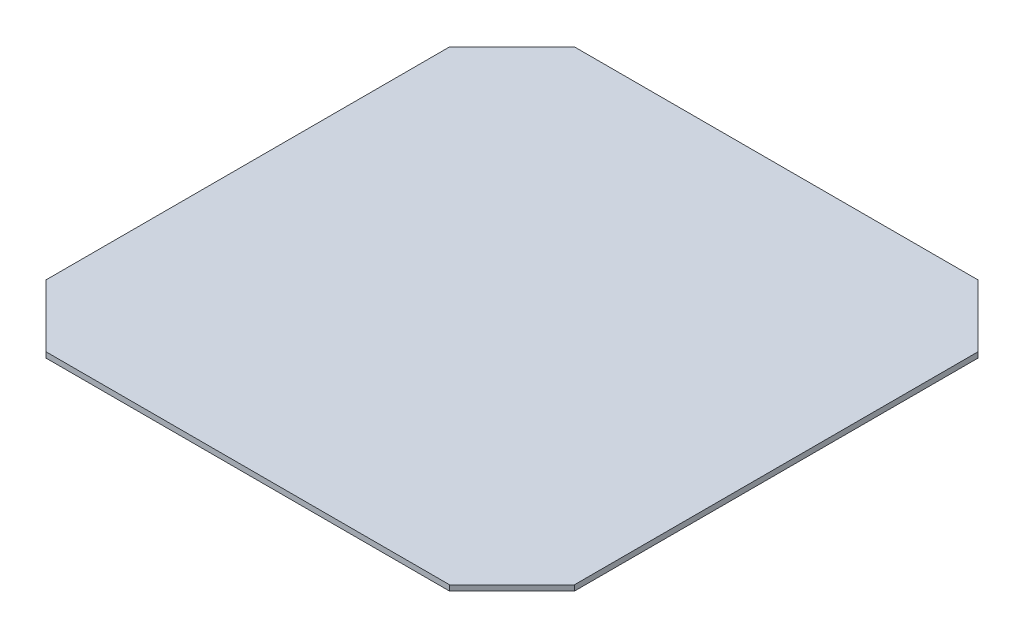
ISO-10303-21;
HEADER;
FILE_DESCRIPTION(('STEP AP214'),'2;1');
FILE_NAME('part.step','',(''),(''),'','','');
FILE_SCHEMA(('AUTOMOTIVE_DESIGN { 1 0 10303 214 1 1 1 1 }'));
ENDSEC;
DATA;
#1=APPLICATION_CONTEXT('core data for automotive mechanical design processes');
#2=APPLICATION_PROTOCOL_DEFINITION('international standard','automotive_design',2000,#1);
#3=PRODUCT_CONTEXT('',#1,'mechanical');
#4=PRODUCT('Part','Part','',(#3));
#5=PRODUCT_RELATED_PRODUCT_CATEGORY('part','',(#4));
#6=PRODUCT_DEFINITION_FORMATION('','',#4);
#7=PRODUCT_DEFINITION_CONTEXT('part definition',#1,'design');
#8=PRODUCT_DEFINITION('design','',#6,#7);
#9=PRODUCT_DEFINITION_SHAPE('','',#8);
#10=(LENGTH_UNIT() NAMED_UNIT(*) SI_UNIT(.MILLI.,.METRE.));
#11=(NAMED_UNIT(*) PLANE_ANGLE_UNIT() SI_UNIT($,.RADIAN.));
#12=(NAMED_UNIT(*) SI_UNIT($,.STERADIAN.) SOLID_ANGLE_UNIT());
#13=UNCERTAINTY_MEASURE_WITH_UNIT(LENGTH_MEASURE(1.E-05),#10,'distance_accuracy_value','');
#14=(GEOMETRIC_REPRESENTATION_CONTEXT(3) GLOBAL_UNCERTAINTY_ASSIGNED_CONTEXT((#13)) GLOBAL_UNIT_ASSIGNED_CONTEXT((#10,
#11,#12)) REPRESENTATION_CONTEXT('',''));
#15=CARTESIAN_POINT('',(0.,0.,0.));
#16=DIRECTION('',(0.,0.,1.));
#17=DIRECTION('',(1.,0.,0.));
#18=AXIS2_PLACEMENT_3D('',#15,#16,#17);
#19=CARTESIAN_POINT('',(-61.7660498386658,3.175,0.));
#20=DIRECTION('',(1.,0.,0.));
#21=DIRECTION('',(0.,0.,-1.));
#22=AXIS2_PLACEMENT_3D('',#19,#20,#21);
#23=PLANE('',#22);
#24=DIRECTION('',(0.,0.,1.));
#25=VECTOR('',#24,1.);
#26=CARTESIAN_POINT('',(-61.7660498386658,0.,0.));
#27=LINE('',#26,#25);
#28=CARTESIAN_POINT('',(-61.7660498386658,0.,-15.7353355825896));
#29=VERTEX_POINT('',#28);
#30=CARTESIAN_POINT('',(-61.7660498386657,0.,217.222615448857));
#31=VERTEX_POINT('',#30);
#32=EDGE_CURVE('E132',#29,#31,#27,.T.);
#33=ORIENTED_EDGE('',*,*,#32,.T.);
#34=DIRECTION('',(0.,-1.,0.));
#35=VECTOR('',#34,1.);
#36=CARTESIAN_POINT('',(-61.7660498386657,3.175,217.222615448857));
#37=LINE('',#36,#35);
#38=CARTESIAN_POINT('',(-61.7660498386657,3.175,217.222615448857));
#39=VERTEX_POINT('',#38);
#40=EDGE_CURVE('E11',#39,#31,#37,.T.);
#41=ORIENTED_EDGE('',*,*,#40,.F.);
#42=DIRECTION('',(0.,0.,1.));
#43=VECTOR('',#42,1.);
#44=CARTESIAN_POINT('',(-61.7660498386658,3.175,0.));
#45=LINE('',#44,#43);
#46=CARTESIAN_POINT('',(-61.7660498386658,3.175,-15.7353355825896));
#47=VERTEX_POINT('',#46);
#48=EDGE_CURVE('E151',#47,#39,#45,.T.);
#49=ORIENTED_EDGE('',*,*,#48,.F.);
#50=DIRECTION('',(0.,-1.,0.));
#51=VECTOR('',#50,1.);
#52=CARTESIAN_POINT('',(-61.7660498386658,3.175,-15.7353355825896));
#53=LINE('',#52,#51);
#54=EDGE_CURVE('E51',#47,#29,#53,.T.);
#55=ORIENTED_EDGE('',*,*,#54,.T.);
#56=EDGE_LOOP('',(#33,#41,#49,#55));
#57=FACE_BOUND('',#56,.T.);
#58=ADVANCED_FACE('F35',(#57),#23,.F.);
#59=CARTESIAN_POINT('',(-139.494332643761,3.175,139.494332643761));
#60=DIRECTION('',(0.707106781186548,0.,-0.707106781186547));
#61=DIRECTION('',(-0.707106781186547,0.,-0.707106781186548));
#62=AXIS2_PLACEMENT_3D('',#59,#60,#61);
#63=PLANE('',#62);
#64=DIRECTION('',(0.707106781186547,0.,0.707106781186548));
#65=VECTOR('',#64,1.);
#66=CARTESIAN_POINT('',(-139.494332643761,0.,139.494332643761));
#67=LINE('',#66,#65);
#68=CARTESIAN_POINT('',(-25.845025354389,0.,253.143639933134));
#69=VERTEX_POINT('',#68);
#70=EDGE_CURVE('E134',#31,#69,#67,.T.);
#71=ORIENTED_EDGE('',*,*,#70,.T.);
#72=DIRECTION('',(0.,-1.,0.));
#73=VECTOR('',#72,1.);
#74=CARTESIAN_POINT('',(-25.845025354389,3.175,253.143639933134));
#75=LINE('',#74,#73);
#76=CARTESIAN_POINT('',(-25.845025354389,3.175,253.143639933134));
#77=VERTEX_POINT('',#76);
#78=EDGE_CURVE('E43',#77,#69,#75,.T.);
#79=ORIENTED_EDGE('',*,*,#78,.F.);
#80=DIRECTION('',(0.707106781186547,0.,0.707106781186548));
#81=VECTOR('',#80,1.);
#82=CARTESIAN_POINT('',(-139.494332643761,3.175,139.494332643761));
#83=LINE('',#82,#81);
#84=EDGE_CURVE('E89',#39,#77,#83,.T.);
#85=ORIENTED_EDGE('',*,*,#84,.F.);
#86=ORIENTED_EDGE('',*,*,#40,.T.);
#87=EDGE_LOOP('',(#71,#79,#85,#86));
#88=FACE_BOUND('',#87,.T.);
#89=ADVANCED_FACE('F178',(#88),#63,.F.);
#90=CARTESIAN_POINT('',(0.,3.175,253.143639933134));
#91=DIRECTION('',(0.,0.,-1.));
#92=DIRECTION('',(-1.,0.,0.));
#93=AXIS2_PLACEMENT_3D('',#90,#91,#92);
#94=PLANE('',#93);
#95=DIRECTION('',(1.,0.,0.));
#96=VECTOR('',#95,1.);
#97=CARTESIAN_POINT('',(0.,0.,253.143639933134));
#98=LINE('',#97,#96);
#99=CARTESIAN_POINT('',(207.112925677057,0.,253.143639933134));
#100=VERTEX_POINT('',#99);
#101=EDGE_CURVE('E136',#69,#100,#98,.T.);
#102=ORIENTED_EDGE('',*,*,#101,.T.);
#103=DIRECTION('',(0.,-1.,0.));
#104=VECTOR('',#103,1.);
#105=CARTESIAN_POINT('',(207.112925677057,3.175,253.143639933134));
#106=LINE('',#105,#104);
#107=CARTESIAN_POINT('',(207.112925677057,3.175,253.143639933134));
#108=VERTEX_POINT('',#107);
#109=EDGE_CURVE('E157',#108,#100,#106,.T.);
#110=ORIENTED_EDGE('',*,*,#109,.F.);
#111=DIRECTION('',(1.,0.,0.));
#112=VECTOR('',#111,1.);
#113=CARTESIAN_POINT('',(0.,3.175,253.143639933134));
#114=LINE('',#113,#112);
#115=EDGE_CURVE('E164',#77,#108,#114,.T.);
#116=ORIENTED_EDGE('',*,*,#115,.F.);
#117=ORIENTED_EDGE('',*,*,#78,.T.);
#118=EDGE_LOOP('',(#102,#110,#116,#117));
#119=FACE_BOUND('',#118,.T.);
#120=ADVANCED_FACE('F162',(#119),#94,.F.);
#121=CARTESIAN_POINT('',(230.128282805096,3.175,230.128282805095));
#122=DIRECTION('',(0.707106781186548,0.,0.707106781186547));
#123=DIRECTION('',(0.707106781186547,0.,-0.707106781186548));
#124=AXIS2_PLACEMENT_3D('',#121,#122,#123);
#125=PLANE('',#124);
#126=DIRECTION('',(-0.707106781186547,0.,0.707106781186548));
#127=VECTOR('',#126,1.);
#128=CARTESIAN_POINT('',(230.128282805096,0.,230.128282805095));
#129=LINE('',#128,#127);
#130=CARTESIAN_POINT('',(243.033950161334,0.,217.222615448857));
#131=VERTEX_POINT('',#130);
#132=EDGE_CURVE('E139',#131,#100,#129,.T.);
#133=ORIENTED_EDGE('',*,*,#132,.F.);
#134=DIRECTION('',(0.,-1.,0.));
#135=VECTOR('',#134,1.);
#136=CARTESIAN_POINT('',(243.033950161334,3.175,217.222615448857));
#137=LINE('',#136,#135);
#138=CARTESIAN_POINT('',(243.033950161334,3.175,217.222615448857));
#139=VERTEX_POINT('',#138);
#140=EDGE_CURVE('E155',#139,#131,#137,.T.);
#141=ORIENTED_EDGE('',*,*,#140,.F.);
#142=DIRECTION('',(-0.707106781186547,0.,0.707106781186548));
#143=VECTOR('',#142,1.);
#144=CARTESIAN_POINT('',(230.128282805096,3.175,230.128282805095));
#145=LINE('',#144,#143);
#146=EDGE_CURVE('E172',#139,#108,#145,.T.);
#147=ORIENTED_EDGE('',*,*,#146,.T.);
#148=ORIENTED_EDGE('',*,*,#109,.T.);
#149=EDGE_LOOP('',(#133,#141,#147,#148));
#150=FACE_BOUND('',#149,.T.);
#151=ADVANCED_FACE('F170',(#150),#125,.T.);
#152=CARTESIAN_POINT('',(243.033950161334,3.175,0.));
#153=DIRECTION('',(1.,0.,0.));
#154=DIRECTION('',(0.,0.,-1.));
#155=AXIS2_PLACEMENT_3D('',#152,#153,#154);
#156=PLANE('',#155);
#157=DIRECTION('',(0.,0.,1.));
#158=VECTOR('',#157,1.);
#159=CARTESIAN_POINT('',(243.033950161334,0.,0.));
#160=LINE('',#159,#158);
#161=CARTESIAN_POINT('',(243.033950161334,0.,-15.7353355825896));
#162=VERTEX_POINT('',#161);
#163=EDGE_CURVE('E142',#162,#131,#160,.T.);
#164=ORIENTED_EDGE('',*,*,#163,.F.);
#165=DIRECTION('',(0.,-1.,0.));
#166=VECTOR('',#165,1.);
#167=CARTESIAN_POINT('',(243.033950161334,3.175,-15.7353355825896));
#168=LINE('',#167,#166);
#169=CARTESIAN_POINT('',(243.033950161334,3.175,-15.7353355825896));
#170=VERTEX_POINT('',#169);
#171=EDGE_CURVE('E124',#170,#162,#168,.T.);
#172=ORIENTED_EDGE('',*,*,#171,.F.);
#173=DIRECTION('',(0.,0.,1.));
#174=VECTOR('',#173,1.);
#175=CARTESIAN_POINT('',(243.033950161334,3.175,0.));
#176=LINE('',#175,#174);
#177=EDGE_CURVE('E114',#170,#139,#176,.T.);
#178=ORIENTED_EDGE('',*,*,#177,.T.);
#179=ORIENTED_EDGE('',*,*,#140,.T.);
#180=EDGE_LOOP('',(#164,#172,#178,#179));
#181=FACE_BOUND('',#180,.T.);
#182=ADVANCED_FACE('F188',(#181),#156,.T.);
#183=CARTESIAN_POINT('',(129.384642871962,3.175,-129.384642871962));
#184=DIRECTION('',(-0.707106781186548,0.,0.707106781186547));
#185=DIRECTION('',(0.707106781186547,0.,0.707106781186548));
#186=AXIS2_PLACEMENT_3D('',#183,#184,#185);
#187=PLANE('',#186);
#188=DIRECTION('',(-0.707106781186547,0.,-0.707106781186549));
#189=VECTOR('',#188,1.);
#190=CARTESIAN_POINT('',(129.384642871962,0.,-129.384642871962));
#191=LINE('',#190,#189);
#192=CARTESIAN_POINT('',(207.112925677058,0.,-51.6563600668662));
#193=VERTEX_POINT('',#192);
#194=EDGE_CURVE('E121',#162,#193,#191,.T.);
#195=ORIENTED_EDGE('',*,*,#194,.T.);
#196=DIRECTION('',(0.,-1.,0.));
#197=VECTOR('',#196,1.);
#198=CARTESIAN_POINT('',(207.112925677058,3.175,-51.6563600668662));
#199=LINE('',#198,#197);
#200=CARTESIAN_POINT('',(207.112925677058,3.175,-51.6563600668662));
#201=VERTEX_POINT('',#200);
#202=EDGE_CURVE('E118',#201,#193,#199,.T.);
#203=ORIENTED_EDGE('',*,*,#202,.F.);
#204=DIRECTION('',(-0.707106781186547,0.,-0.707106781186549));
#205=VECTOR('',#204,1.);
#206=CARTESIAN_POINT('',(129.384642871962,3.175,-129.384642871962));
#207=LINE('',#206,#205);
#208=EDGE_CURVE('E106',#170,#201,#207,.T.);
#209=ORIENTED_EDGE('',*,*,#208,.F.);
#210=ORIENTED_EDGE('',*,*,#171,.T.);
#211=EDGE_LOOP('',(#195,#203,#209,#210));
#212=FACE_BOUND('',#211,.T.);
#213=ADVANCED_FACE('F119',(#212),#187,.F.);
#214=CARTESIAN_POINT('',(0.,3.175,-51.6563600668662));
#215=DIRECTION('',(0.,0.,-1.));
#216=DIRECTION('',(-1.,0.,0.));
#217=AXIS2_PLACEMENT_3D('',#214,#215,#216);
#218=PLANE('',#217);
#219=DIRECTION('',(1.,0.,0.));
#220=VECTOR('',#219,1.);
#221=CARTESIAN_POINT('',(0.,0.,-51.6563600668662));
#222=LINE('',#221,#220);
#223=CARTESIAN_POINT('',(-25.8450253543892,0.,-51.6563600668663));
#224=VERTEX_POINT('',#223);
#225=EDGE_CURVE('E146',#224,#193,#222,.T.);
#226=ORIENTED_EDGE('',*,*,#225,.F.);
#227=DIRECTION('',(0.,-1.,0.));
#228=VECTOR('',#227,1.);
#229=CARTESIAN_POINT('',(-25.8450253543892,3.175,-51.6563600668663));
#230=LINE('',#229,#228);
#231=CARTESIAN_POINT('',(-25.8450253543892,3.175,-51.6563600668663));
#232=VERTEX_POINT('',#231);
#233=EDGE_CURVE('E77',#232,#224,#230,.T.);
#234=ORIENTED_EDGE('',*,*,#233,.F.);
#235=DIRECTION('',(1.,0.,0.));
#236=VECTOR('',#235,1.);
#237=CARTESIAN_POINT('',(0.,3.175,-51.6563600668662));
#238=LINE('',#237,#236);
#239=EDGE_CURVE('E111',#232,#201,#238,.T.);
#240=ORIENTED_EDGE('',*,*,#239,.T.);
#241=ORIENTED_EDGE('',*,*,#202,.T.);
#242=EDGE_LOOP('',(#226,#234,#240,#241));
#243=FACE_BOUND('',#242,.T.);
#244=ADVANCED_FACE('F126',(#243),#218,.T.);
#245=CARTESIAN_POINT('',(-38.7506927106278,3.175,-38.7506927106277));
#246=DIRECTION('',(-0.707106781186549,0.,-0.707106781186546));
#247=DIRECTION('',(-0.707106781186546,0.,0.707106781186549));
#248=AXIS2_PLACEMENT_3D('',#245,#246,#247);
#249=PLANE('',#248);
#250=DIRECTION('',(0.707106781186546,0.,-0.707106781186549));
#251=VECTOR('',#250,1.);
#252=CARTESIAN_POINT('',(-38.7506927106278,0.,-38.7506927106277));
#253=LINE('',#252,#251);
#254=EDGE_CURVE('E148',#29,#224,#253,.T.);
#255=ORIENTED_EDGE('',*,*,#254,.F.);
#256=ORIENTED_EDGE('',*,*,#54,.F.);
#257=DIRECTION('',(0.707106781186546,0.,-0.707106781186549));
#258=VECTOR('',#257,1.);
#259=CARTESIAN_POINT('',(-38.7506927106278,3.175,-38.7506927106277));
#260=LINE('',#259,#258);
#261=EDGE_CURVE('E127',#47,#232,#260,.T.);
#262=ORIENTED_EDGE('',*,*,#261,.T.);
#263=ORIENTED_EDGE('',*,*,#233,.T.);
#264=EDGE_LOOP('',(#255,#256,#262,#263));
#265=FACE_BOUND('',#264,.T.);
#266=ADVANCED_FACE('F196',(#265),#249,.T.);
#267=CARTESIAN_POINT('',(0.,3.175,0.));
#268=DIRECTION('',(0.,1.,0.));
#269=DIRECTION('',(0.,0.,1.));
#270=AXIS2_PLACEMENT_3D('',#267,#268,#269);
#271=PLANE('',#270);
#272=ORIENTED_EDGE('',*,*,#48,.T.);
#273=ORIENTED_EDGE('',*,*,#84,.T.);
#274=ORIENTED_EDGE('',*,*,#115,.T.);
#275=ORIENTED_EDGE('',*,*,#146,.F.);
#276=ORIENTED_EDGE('',*,*,#177,.F.);
#277=ORIENTED_EDGE('',*,*,#208,.T.);
#278=ORIENTED_EDGE('',*,*,#239,.F.);
#279=ORIENTED_EDGE('',*,*,#261,.F.);
#280=EDGE_LOOP('',(#272,#273,#274,#275,#276,#277,#278,#279));
#281=FACE_BOUND('',#280,.T.);
#282=ADVANCED_FACE('F108',(#281),#271,.T.);
#283=CARTESIAN_POINT('',(0.,0.,0.));
#284=DIRECTION('',(0.,1.,0.));
#285=DIRECTION('',(0.,0.,1.));
#286=AXIS2_PLACEMENT_3D('',#283,#284,#285);
#287=PLANE('',#286);
#288=ORIENTED_EDGE('',*,*,#32,.F.);
#289=ORIENTED_EDGE('',*,*,#254,.T.);
#290=ORIENTED_EDGE('',*,*,#225,.T.);
#291=ORIENTED_EDGE('',*,*,#194,.F.);
#292=ORIENTED_EDGE('',*,*,#163,.T.);
#293=ORIENTED_EDGE('',*,*,#132,.T.);
#294=ORIENTED_EDGE('',*,*,#101,.F.);
#295=ORIENTED_EDGE('',*,*,#70,.F.);
#296=EDGE_LOOP('',(#288,#289,#290,#291,#292,#293,#294,#295));
#297=FACE_BOUND('',#296,.T.);
#298=ADVANCED_FACE('F166',(#297),#287,.F.);
#299=CLOSED_SHELL('',(#58,#89,#120,#151,#182,#213,#244,#266,#282,#298));
#300=MANIFOLD_SOLID_BREP('B2',#299);
#301=ADVANCED_BREP_SHAPE_REPRESENTATION('',(#18,#300),#14);
#302=SHAPE_DEFINITION_REPRESENTATION(#9,#301);
ENDSEC;
END-ISO-10303-21;
